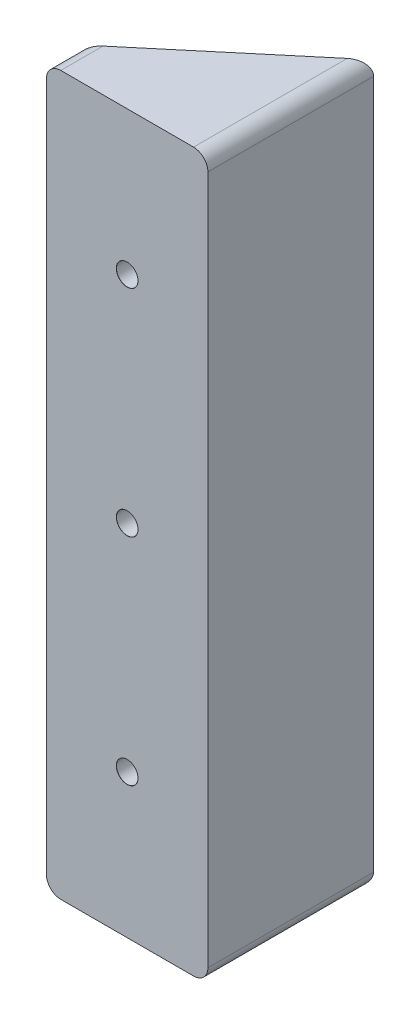
ISO-10303-21;
HEADER;
FILE_DESCRIPTION(('STEP AP214'),'2;1');
FILE_NAME('part.step','',(''),(''),'','','');
FILE_SCHEMA(('AUTOMOTIVE_DESIGN { 1 0 10303 214 1 1 1 1 }'));
ENDSEC;
DATA;
#1=APPLICATION_CONTEXT('core data for automotive mechanical design processes');
#2=APPLICATION_PROTOCOL_DEFINITION('international standard','automotive_design',2000,#1);
#3=PRODUCT_CONTEXT('',#1,'mechanical');
#4=PRODUCT('Part','Part','',(#3));
#5=PRODUCT_RELATED_PRODUCT_CATEGORY('part','',(#4));
#6=PRODUCT_DEFINITION_FORMATION('','',#4);
#7=PRODUCT_DEFINITION_CONTEXT('part definition',#1,'design');
#8=PRODUCT_DEFINITION('design','',#6,#7);
#9=PRODUCT_DEFINITION_SHAPE('','',#8);
#10=(LENGTH_UNIT() NAMED_UNIT(*) SI_UNIT(.MILLI.,.METRE.));
#11=(NAMED_UNIT(*) PLANE_ANGLE_UNIT() SI_UNIT($,.RADIAN.));
#12=(NAMED_UNIT(*) SI_UNIT($,.STERADIAN.) SOLID_ANGLE_UNIT());
#13=UNCERTAINTY_MEASURE_WITH_UNIT(LENGTH_MEASURE(1.E-05),#10,'distance_accuracy_value','');
#14=(GEOMETRIC_REPRESENTATION_CONTEXT(3) GLOBAL_UNCERTAINTY_ASSIGNED_CONTEXT((#13)) GLOBAL_UNIT_ASSIGNED_CONTEXT((#10,
#11,#12)) REPRESENTATION_CONTEXT('',''));
#15=CARTESIAN_POINT('',(0.,0.,0.));
#16=DIRECTION('',(0.,0.,1.));
#17=DIRECTION('',(1.,0.,0.));
#18=AXIS2_PLACEMENT_3D('',#15,#16,#17);
#19=CARTESIAN_POINT('',(13.8117445887715,134.272684877163,500.));
#20=DIRECTION('',(-1.,0.,0.));
#21=DIRECTION('',(0.,0.,1.));
#22=AXIS2_PLACEMENT_3D('',#19,#20,#21);
#23=PLANE('',#22);
#24=DIRECTION('',(0.,1.,0.));
#25=VECTOR('',#24,1.);
#26=CARTESIAN_POINT('',(13.8117445887715,-985.031144248079,47.1850959611087));
#27=LINE('',#26,#25);
#28=CARTESIAN_POINT('',(13.8117445887715,-61.7273151228369,47.1850959611087));
#29=VERTEX_POINT('',#28);
#30=CARTESIAN_POINT('',(13.8117445887715,130.272684877163,47.1850959611086));
#31=VERTEX_POINT('',#30);
#32=EDGE_CURVE('E49',#29,#31,#27,.T.);
#33=ORIENTED_EDGE('',*,*,#32,.F.);
#34=DIRECTION('',(0.,0.,-1.));
#35=VECTOR('',#34,1.);
#36=CARTESIAN_POINT('',(13.8117445887715,-61.7273151228369,500.));
#37=LINE('',#36,#35);
#38=CARTESIAN_POINT('',(13.8117445887715,-61.7273151228369,1.02723667248412));
#39=VERTEX_POINT('',#38);
#40=EDGE_CURVE('E128',#29,#39,#37,.T.);
#41=ORIENTED_EDGE('',*,*,#40,.T.);
#42=DIRECTION('',(0.,-1.,0.));
#43=VECTOR('',#42,1.);
#44=CARTESIAN_POINT('',(13.8117445887714,814.76440392337,1.02723667248411));
#45=LINE('',#44,#43);
#46=CARTESIAN_POINT('',(13.8117445887715,130.272684877163,1.02723667248412));
#47=VERTEX_POINT('',#46);
#48=EDGE_CURVE('E117',#47,#39,#45,.T.);
#49=ORIENTED_EDGE('',*,*,#48,.F.);
#50=DIRECTION('',(0.,0.,-1.));
#51=VECTOR('',#50,1.);
#52=CARTESIAN_POINT('',(13.8117445887715,130.272684877163,500.));
#53=LINE('',#52,#51);
#54=EDGE_CURVE('E124',#47,#31,#53,.F.);
#55=ORIENTED_EDGE('',*,*,#54,.T.);
#56=EDGE_LOOP('',(#33,#41,#49,#55));
#57=FACE_BOUND('',#56,.T.);
#58=ADVANCED_FACE('F32',(#57),#23,.F.);
#59=CARTESIAN_POINT('',(-31.1882554112285,134.272684877163,500.));
#60=DIRECTION('',(0.,-1.,0.));
#61=DIRECTION('',(0.,0.,-1.));
#62=AXIS2_PLACEMENT_3D('',#59,#60,#61);
#63=PLANE('',#62);
#64=DIRECTION('',(-1.,0.,0.));
#65=VECTOR('',#64,1.);
#66=CARTESIAN_POINT('',(-31.188255411228,134.272684877163,47.1850959611086));
#67=LINE('',#66,#65);
#68=CARTESIAN_POINT('',(9.81174458877147,134.272684877163,47.1850959611086));
#69=VERTEX_POINT('',#68);
#70=CARTESIAN_POINT('',(-27.1882554112285,134.272684877163,47.1850959611086));
#71=VERTEX_POINT('',#70);
#72=EDGE_CURVE('E158',#69,#71,#67,.T.);
#73=ORIENTED_EDGE('',*,*,#72,.F.);
#74=DIRECTION('',(0.,0.,-1.));
#75=VECTOR('',#74,1.);
#76=CARTESIAN_POINT('',(9.81174458877147,134.272684877163,500.));
#77=LINE('',#76,#75);
#78=CARTESIAN_POINT('',(9.81174458877147,134.272684877163,4.38338323489235));
#79=VERTEX_POINT('',#78);
#80=EDGE_CURVE('E56',#69,#79,#77,.T.);
#81=ORIENTED_EDGE('',*,*,#80,.T.);
#82=DIRECTION('',(0.766068203582476,0.,-0.642759292005894));
#83=VECTOR('',#82,1.);
#84=CARTESIAN_POINT('',(-258.289896932573,134.272684877163,229.330483876858));
#85=LINE('',#84,#83);
#86=CARTESIAN_POINT('',(-27.1882554112285,134.272684877163,35.4277389371684));
#87=VERTEX_POINT('',#86);
#88=EDGE_CURVE('E171',#87,#79,#85,.T.);
#89=ORIENTED_EDGE('',*,*,#88,.F.);
#90=DIRECTION('',(0.,0.,-1.));
#91=VECTOR('',#90,1.);
#92=CARTESIAN_POINT('',(-27.1882554112285,134.272684877163,500.));
#93=LINE('',#92,#91);
#94=EDGE_CURVE('E41',#87,#71,#93,.F.);
#95=ORIENTED_EDGE('',*,*,#94,.T.);
#96=EDGE_LOOP('',(#73,#81,#89,#95));
#97=FACE_BOUND('',#96,.T.);
#98=ADVANCED_FACE('F200',(#97),#63,.F.);
#99=CARTESIAN_POINT('',(-31.1882554112285,-65.7273151228369,500.));
#100=DIRECTION('',(0.,1.,0.));
#101=DIRECTION('',(0.,0.,1.));
#102=AXIS2_PLACEMENT_3D('',#99,#100,#101);
#103=PLANE('',#102);
#104=DIRECTION('',(1.,0.,0.));
#105=VECTOR('',#104,1.);
#106=CARTESIAN_POINT('',(-31.188255411228,-65.7273151228369,47.1850959611086));
#107=LINE('',#106,#105);
#108=CARTESIAN_POINT('',(-27.1882554112285,-65.7273151228369,47.1850959611086));
#109=VERTEX_POINT('',#108);
#110=CARTESIAN_POINT('',(9.81174458877147,-65.7273151228369,47.1850959611086));
#111=VERTEX_POINT('',#110);
#112=EDGE_CURVE('E118',#109,#111,#107,.T.);
#113=ORIENTED_EDGE('',*,*,#112,.F.);
#114=DIRECTION('',(0.,0.,-1.));
#115=VECTOR('',#114,1.);
#116=CARTESIAN_POINT('',(-27.1882554112285,-65.7273151228369,500.));
#117=LINE('',#116,#115);
#118=CARTESIAN_POINT('',(-27.1882554112285,-65.7273151228369,35.4277389371684));
#119=VERTEX_POINT('',#118);
#120=EDGE_CURVE('E116',#109,#119,#117,.T.);
#121=ORIENTED_EDGE('',*,*,#120,.T.);
#122=DIRECTION('',(-0.766068203582476,0.,0.642759292005894));
#123=VECTOR('',#122,1.);
#124=CARTESIAN_POINT('',(-258.289896932573,-65.7273151228369,229.330483876858));
#125=LINE('',#124,#123);
#126=CARTESIAN_POINT('',(9.81174458877147,-65.7273151228369,4.38338323489235));
#127=VERTEX_POINT('',#126);
#128=EDGE_CURVE('E179',#127,#119,#125,.T.);
#129=ORIENTED_EDGE('',*,*,#128,.F.);
#130=DIRECTION('',(0.,0.,-1.));
#131=VECTOR('',#130,1.);
#132=CARTESIAN_POINT('',(9.81174458877147,-65.7273151228369,500.));
#133=LINE('',#132,#131);
#134=EDGE_CURVE('E185',#127,#111,#133,.F.);
#135=ORIENTED_EDGE('',*,*,#134,.T.);
#136=EDGE_LOOP('',(#113,#121,#129,#135));
#137=FACE_BOUND('',#136,.T.);
#138=ADVANCED_FACE('F189',(#137),#103,.F.);
#139=CARTESIAN_POINT('',(-27.1882554112285,-61.7273151228369,500.));
#140=DIRECTION('',(0.,0.,-1.));
#141=DIRECTION('',(-1.,0.,0.));
#142=AXIS2_PLACEMENT_3D('',#139,#140,#141);
#143=CYLINDRICAL_SURFACE('',#142,4.);
#144=ORIENTED_EDGE('',*,*,#120,.F.);
#145=CARTESIAN_POINT('',(-27.1882554112285,-61.7273151228369,47.1850959611086));
#146=DIRECTION('',(0.,0.,1.));
#147=DIRECTION('',(1.,0.,0.));
#148=AXIS2_PLACEMENT_3D('',#145,#146,#147);
#149=CIRCLE('',#148,4.);
#150=CARTESIAN_POINT('',(-31.1882554112285,-61.7273151228369,47.1850959611086));
#151=VERTEX_POINT('',#150);
#152=EDGE_CURVE('E101',#109,#151,#149,.F.);
#153=ORIENTED_EDGE('',*,*,#152,.T.);
#154=DIRECTION('',(0.,0.,-1.));
#155=VECTOR('',#154,1.);
#156=CARTESIAN_POINT('',(-31.1882554112285,-61.7273151228369,500.));
#157=LINE('',#156,#155);
#158=CARTESIAN_POINT('',(-31.1882554112285,-61.7273151228367,38.7838854995766));
#159=VERTEX_POINT('',#158);
#160=EDGE_CURVE('E115',#159,#151,#157,.F.);
#161=ORIENTED_EDGE('',*,*,#160,.F.);
#162=CARTESIAN_POINT('',(-27.1882554112285,-61.7273151228369,35.4277389371684));
#163=DIRECTION('',(-0.642759292005894,0.,-0.766068203582476));
#164=DIRECTION('',(0.766068203582476,0.,-0.642759292005894));
#165=AXIS2_PLACEMENT_3D('',#162,#163,#164);
#166=ELLIPSE('',#165,5.22146720265143,4.);
#167=EDGE_CURVE('E182',#159,#119,#166,.F.);
#168=ORIENTED_EDGE('',*,*,#167,.T.);
#169=EDGE_LOOP('',(#144,#153,#161,#168));
#170=FACE_BOUND('',#169,.T.);
#171=ADVANCED_FACE('F113',(#170),#143,.T.);
#172=CARTESIAN_POINT('',(9.81174458877148,-61.7273151228369,500.));
#173=DIRECTION('',(0.,0.,-1.));
#174=DIRECTION('',(-1.,0.,0.));
#175=AXIS2_PLACEMENT_3D('',#172,#173,#174);
#176=CYLINDRICAL_SURFACE('',#175,4.);
#177=ORIENTED_EDGE('',*,*,#40,.F.);
#178=CARTESIAN_POINT('',(9.81174458877148,-61.7273151228369,47.1850959611086));
#179=DIRECTION('',(0.,0.,1.));
#180=DIRECTION('',(1.,0.,0.));
#181=AXIS2_PLACEMENT_3D('',#178,#179,#180);
#182=CIRCLE('',#181,4.);
#183=EDGE_CURVE('E162',#29,#111,#182,.F.);
#184=ORIENTED_EDGE('',*,*,#183,.T.);
#185=ORIENTED_EDGE('',*,*,#134,.F.);
#186=CARTESIAN_POINT('',(9.81174458877148,-61.7273151228369,4.38338323489235));
#187=DIRECTION('',(-0.642759292005894,0.,-0.766068203582476));
#188=DIRECTION('',(0.766068203582476,0.,-0.642759292005894));
#189=AXIS2_PLACEMENT_3D('',#186,#187,#188);
#190=ELLIPSE('',#189,5.22146720265143,4.);
#191=EDGE_CURVE('E176',#127,#39,#190,.F.);
#192=ORIENTED_EDGE('',*,*,#191,.T.);
#193=EDGE_LOOP('',(#177,#184,#185,#192));
#194=FACE_BOUND('',#193,.T.);
#195=ADVANCED_FACE('F196',(#194),#176,.T.);
#196=CARTESIAN_POINT('',(-27.1882554112285,130.272684877163,500.));
#197=DIRECTION('',(0.,0.,-1.));
#198=DIRECTION('',(-1.,0.,0.));
#199=AXIS2_PLACEMENT_3D('',#196,#197,#198);
#200=CYLINDRICAL_SURFACE('',#199,4.);
#201=DIRECTION('',(0.,0.,-1.));
#202=VECTOR('',#201,1.);
#203=CARTESIAN_POINT('',(-31.1882554112285,130.272684877163,500.));
#204=LINE('',#203,#202);
#205=CARTESIAN_POINT('',(-31.1882554112285,130.272684877163,47.1850959611086));
#206=VERTEX_POINT('',#205);
#207=CARTESIAN_POINT('',(-31.1882554112285,130.272684877163,38.7838854995766));
#208=VERTEX_POINT('',#207);
#209=EDGE_CURVE('E125',#206,#208,#204,.T.);
#210=ORIENTED_EDGE('',*,*,#209,.F.);
#211=CARTESIAN_POINT('',(-27.1882554112285,130.272684877163,47.1850959611086));
#212=DIRECTION('',(0.,0.,1.));
#213=DIRECTION('',(1.,0.,0.));
#214=AXIS2_PLACEMENT_3D('',#211,#212,#213);
#215=CIRCLE('',#214,4.);
#216=EDGE_CURVE('E104',#206,#71,#215,.F.);
#217=ORIENTED_EDGE('',*,*,#216,.T.);
#218=ORIENTED_EDGE('',*,*,#94,.F.);
#219=CARTESIAN_POINT('',(-27.1882554112285,130.272684877163,35.4277389371684));
#220=DIRECTION('',(-0.642759292005894,0.,-0.766068203582476));
#221=DIRECTION('',(0.766068203582476,0.,-0.642759292005894));
#222=AXIS2_PLACEMENT_3D('',#219,#220,#221);
#223=ELLIPSE('',#222,5.22146720265143,4.);
#224=EDGE_CURVE('E173',#87,#208,#223,.F.);
#225=ORIENTED_EDGE('',*,*,#224,.T.);
#226=EDGE_LOOP('',(#210,#217,#218,#225));
#227=FACE_BOUND('',#226,.T.);
#228=ADVANCED_FACE('F203',(#227),#200,.T.);
#229=CARTESIAN_POINT('',(9.81174458877147,130.272684877163,500.));
#230=DIRECTION('',(0.,0.,-1.));
#231=DIRECTION('',(-1.,0.,0.));
#232=AXIS2_PLACEMENT_3D('',#229,#230,#231);
#233=CYLINDRICAL_SURFACE('',#232,4.);
#234=ORIENTED_EDGE('',*,*,#80,.F.);
#235=CARTESIAN_POINT('',(9.81174458877147,130.272684877163,47.1850959611086));
#236=DIRECTION('',(0.,0.,1.));
#237=DIRECTION('',(1.,0.,0.));
#238=AXIS2_PLACEMENT_3D('',#235,#236,#237);
#239=CIRCLE('',#238,4.);
#240=EDGE_CURVE('E11',#69,#31,#239,.F.);
#241=ORIENTED_EDGE('',*,*,#240,.T.);
#242=ORIENTED_EDGE('',*,*,#54,.F.);
#243=CARTESIAN_POINT('',(9.81174458877147,130.272684877163,4.38338323489235));
#244=DIRECTION('',(-0.642759292005894,0.,-0.766068203582476));
#245=DIRECTION('',(0.766068203582476,0.,-0.642759292005894));
#246=AXIS2_PLACEMENT_3D('',#243,#244,#245);
#247=ELLIPSE('',#246,5.22146720265143,4.);
#248=EDGE_CURVE('E168',#47,#79,#247,.F.);
#249=ORIENTED_EDGE('',*,*,#248,.T.);
#250=EDGE_LOOP('',(#234,#241,#242,#249));
#251=FACE_BOUND('',#250,.T.);
#252=ADVANCED_FACE('F34',(#251),#233,.T.);
#253=CARTESIAN_POINT('',(-31.1882554112285,134.272684877163,500.));
#254=DIRECTION('',(1.,0.,0.));
#255=DIRECTION('',(0.,1.,0.));
#256=AXIS2_PLACEMENT_3D('',#253,#254,#255);
#257=PLANE('',#256);
#258=ORIENTED_EDGE('',*,*,#160,.T.);
#259=DIRECTION('',(0.,1.,0.));
#260=VECTOR('',#259,1.);
#261=CARTESIAN_POINT('',(-31.1882554112285,-985.031144248079,47.1850959611086));
#262=LINE('',#261,#260);
#263=EDGE_CURVE('E98',#151,#206,#262,.T.);
#264=ORIENTED_EDGE('',*,*,#263,.T.);
#265=ORIENTED_EDGE('',*,*,#209,.T.);
#266=DIRECTION('',(0.,-1.,0.));
#267=VECTOR('',#266,1.);
#268=CARTESIAN_POINT('',(-31.1882554112285,814.76440392337,38.7838854995766));
#269=LINE('',#268,#267);
#270=EDGE_CURVE('E123',#208,#159,#269,.T.);
#271=ORIENTED_EDGE('',*,*,#270,.T.);
#272=EDGE_LOOP('',(#258,#264,#265,#271));
#273=FACE_BOUND('',#272,.T.);
#274=ADVANCED_FACE('F121',(#273),#257,.F.);
#275=CARTESIAN_POINT('',(-31.1882554112285,814.76440392337,38.7838854995766));
#276=DIRECTION('',(-0.642759292005894,0.,-0.766068203582476));
#277=DIRECTION('',(-0.766068203582476,0.,0.642759292005894));
#278=AXIS2_PLACEMENT_3D('',#275,#276,#277);
#279=PLANE('',#278);
#280=CARTESIAN_POINT('',(-8.68825541122953,-25.7273151228364,19.9055610860312));
#281=DIRECTION('',(-0.642759292005894,0.,-0.766068203582476));
#282=DIRECTION('',(-0.766068203582476,0.,0.642759292005894));
#283=AXIS2_PLACEMENT_3D('',#280,#281,#282);
#284=ELLIPSE('',#283,3.91610040198854,2.99999999999998);
#285=CARTESIAN_POINT('',(-11.6882554112295,-25.7273151228364,22.4226710078373));
#286=VERTEX_POINT('',#285);
#287=EDGE_CURVE('E36',#286,#286,#284,.T.);
#288=ORIENTED_EDGE('',*,*,#287,.F.);
#289=EDGE_LOOP('',(#288));
#290=FACE_BOUND('',#289,.T.);
#291=CARTESIAN_POINT('',(-8.68825541122953,34.2726848771629,19.9055610860312));
#292=DIRECTION('',(-0.642759292005894,0.,-0.766068203582476));
#293=DIRECTION('',(-0.766068203582476,0.,0.642759292005894));
#294=AXIS2_PLACEMENT_3D('',#291,#292,#293);
#295=ELLIPSE('',#294,3.91610040198854,2.99999999999998);
#296=CARTESIAN_POINT('',(-11.6882554112295,34.2726848771629,22.4226710078373));
#297=VERTEX_POINT('',#296);
#298=EDGE_CURVE('E139',#297,#297,#295,.T.);
#299=ORIENTED_EDGE('',*,*,#298,.F.);
#300=EDGE_LOOP('',(#299));
#301=FACE_BOUND('',#300,.T.);
#302=CARTESIAN_POINT('',(-8.68825541122953,94.2726848771629,19.9055610860312));
#303=DIRECTION('',(-0.642759292005894,0.,-0.766068203582476));
#304=DIRECTION('',(-0.766068203582476,0.,0.642759292005894));
#305=AXIS2_PLACEMENT_3D('',#302,#303,#304);
#306=ELLIPSE('',#305,3.91610040198854,2.99999999999998);
#307=CARTESIAN_POINT('',(-11.6882554112295,94.2726848771629,22.4226710078373));
#308=VERTEX_POINT('',#307);
#309=EDGE_CURVE('E108',#308,#308,#306,.T.);
#310=ORIENTED_EDGE('',*,*,#309,.F.);
#311=EDGE_LOOP('',(#310));
#312=FACE_BOUND('',#311,.T.);
#313=ORIENTED_EDGE('',*,*,#167,.F.);
#314=ORIENTED_EDGE('',*,*,#270,.F.);
#315=ORIENTED_EDGE('',*,*,#224,.F.);
#316=ORIENTED_EDGE('',*,*,#88,.T.);
#317=ORIENTED_EDGE('',*,*,#248,.F.);
#318=ORIENTED_EDGE('',*,*,#48,.T.);
#319=ORIENTED_EDGE('',*,*,#191,.F.);
#320=ORIENTED_EDGE('',*,*,#128,.T.);
#321=EDGE_LOOP('',(#313,#314,#315,#316,#317,#318,#319,#320));
#322=FACE_BOUND('',#321,.T.);
#323=ADVANCED_FACE('F192',(#290,#301,#312,#322),#279,.T.);
#324=CARTESIAN_POINT('',(-31.1882554112285,-985.031144248079,47.1850959611086));
#325=DIRECTION('',(0.,0.,1.));
#326=DIRECTION('',(1.,0.,0.));
#327=AXIS2_PLACEMENT_3D('',#324,#325,#326);
#328=PLANE('',#327);
#329=CARTESIAN_POINT('',(-8.68825541122953,-25.7273151228364,47.1850959611085));
#330=DIRECTION('',(0.,0.,1.));
#331=DIRECTION('',(1.,0.,0.));
#332=AXIS2_PLACEMENT_3D('',#329,#330,#331);
#333=CIRCLE('',#332,3.025);
#334=CARTESIAN_POINT('',(-5.66325541122953,-25.7273151228364,47.1850959611085));
#335=VERTEX_POINT('',#334);
#336=EDGE_CURVE('E335',#335,#335,#333,.T.);
#337=ORIENTED_EDGE('',*,*,#336,.F.);
#338=EDGE_LOOP('',(#337));
#339=FACE_BOUND('',#338,.T.);
#340=CARTESIAN_POINT('',(-8.68825541122953,34.2726848771629,47.1850959611085));
#341=DIRECTION('',(0.,0.,1.));
#342=DIRECTION('',(1.,0.,0.));
#343=AXIS2_PLACEMENT_3D('',#340,#341,#342);
#344=CIRCLE('',#343,3.025);
#345=CARTESIAN_POINT('',(-5.66325541122953,34.2726848771629,47.1850959611085));
#346=VERTEX_POINT('',#345);
#347=EDGE_CURVE('E148',#346,#346,#344,.T.);
#348=ORIENTED_EDGE('',*,*,#347,.F.);
#349=EDGE_LOOP('',(#348));
#350=FACE_BOUND('',#349,.T.);
#351=CARTESIAN_POINT('',(-8.68825541122953,94.2726848771629,47.1850959611085));
#352=DIRECTION('',(0.,0.,1.));
#353=DIRECTION('',(1.,0.,0.));
#354=AXIS2_PLACEMENT_3D('',#351,#352,#353);
#355=CIRCLE('',#354,3.025);
#356=CARTESIAN_POINT('',(-5.66325541122953,94.2726848771629,47.1850959611085));
#357=VERTEX_POINT('',#356);
#358=EDGE_CURVE('E141',#357,#357,#355,.T.);
#359=ORIENTED_EDGE('',*,*,#358,.F.);
#360=EDGE_LOOP('',(#359));
#361=FACE_BOUND('',#360,.T.);
#362=ORIENTED_EDGE('',*,*,#152,.F.);
#363=ORIENTED_EDGE('',*,*,#112,.T.);
#364=ORIENTED_EDGE('',*,*,#183,.F.);
#365=ORIENTED_EDGE('',*,*,#32,.T.);
#366=ORIENTED_EDGE('',*,*,#240,.F.);
#367=ORIENTED_EDGE('',*,*,#72,.T.);
#368=ORIENTED_EDGE('',*,*,#216,.F.);
#369=ORIENTED_EDGE('',*,*,#263,.F.);
#370=EDGE_LOOP('',(#362,#363,#364,#365,#366,#367,#368,#369));
#371=FACE_BOUND('',#370,.T.);
#372=ADVANCED_FACE('F100',(#339,#350,#361,#371),#328,.T.);
#373=CARTESIAN_POINT('',(-8.68825541122953,94.2726848771629,47.1850959611085));
#374=DIRECTION('',(0.,0.,1.));
#375=DIRECTION('',(1.,0.,0.));
#376=AXIS2_PLACEMENT_3D('',#373,#374,#375);
#377=CYLINDRICAL_SURFACE('',#376,2.99999999999998);
#378=ORIENTED_EDGE('',*,*,#309,.T.);
#379=EDGE_LOOP('',(#378));
#380=FACE_BOUND('',#379,.T.);
#381=CARTESIAN_POINT('',(-8.68825541122953,94.2726848771629,47.1600959611085));
#382=DIRECTION('',(0.,0.,1.));
#383=DIRECTION('',(1.,0.,0.));
#384=AXIS2_PLACEMENT_3D('',#381,#382,#383);
#385=CIRCLE('',#384,2.99999999999998);
#386=CARTESIAN_POINT('',(-5.68825541122954,94.2726848771629,47.1600959611085));
#387=VERTEX_POINT('',#386);
#388=EDGE_CURVE('E138',#387,#387,#385,.T.);
#389=ORIENTED_EDGE('',*,*,#388,.T.);
#390=EDGE_LOOP('',(#389));
#391=FACE_BOUND('',#390,.T.);
#392=ADVANCED_FACE('F266',(#380,#391),#377,.F.);
#393=CARTESIAN_POINT('',(-8.68825541122953,94.2726848771629,47.1850959611085));
#394=DIRECTION('',(0.,0.,1.));
#395=DIRECTION('',(1.,0.,0.));
#396=AXIS2_PLACEMENT_3D('',#393,#394,#395);
#397=CONICAL_SURFACE('',#396,3.025,0.785398163397258);
#398=ORIENTED_EDGE('',*,*,#388,.F.);
#399=EDGE_LOOP('',(#398));
#400=FACE_BOUND('',#399,.T.);
#401=ORIENTED_EDGE('',*,*,#358,.T.);
#402=EDGE_LOOP('',(#401));
#403=FACE_BOUND('',#402,.T.);
#404=ADVANCED_FACE('F276',(#400,#403),#397,.F.);
#405=CARTESIAN_POINT('',(-8.68825541122953,34.2726848771629,47.1850959611085));
#406=DIRECTION('',(0.,0.,1.));
#407=DIRECTION('',(1.,0.,0.));
#408=AXIS2_PLACEMENT_3D('',#405,#406,#407);
#409=CYLINDRICAL_SURFACE('',#408,2.99999999999998);
#410=ORIENTED_EDGE('',*,*,#298,.T.);
#411=EDGE_LOOP('',(#410));
#412=FACE_BOUND('',#411,.T.);
#413=CARTESIAN_POINT('',(-8.68825541122953,34.2726848771629,47.1600959611085));
#414=DIRECTION('',(0.,0.,1.));
#415=DIRECTION('',(1.,0.,0.));
#416=AXIS2_PLACEMENT_3D('',#413,#414,#415);
#417=CIRCLE('',#416,2.99999999999998);
#418=CARTESIAN_POINT('',(-5.68825541122954,34.2726848771629,47.1600959611085));
#419=VERTEX_POINT('',#418);
#420=EDGE_CURVE('E142',#419,#419,#417,.T.);
#421=ORIENTED_EDGE('',*,*,#420,.T.);
#422=EDGE_LOOP('',(#421));
#423=FACE_BOUND('',#422,.T.);
#424=ADVANCED_FACE('F286',(#412,#423),#409,.F.);
#425=CARTESIAN_POINT('',(-8.68825541122953,34.2726848771629,47.1850959611085));
#426=DIRECTION('',(0.,0.,1.));
#427=DIRECTION('',(1.,0.,0.));
#428=AXIS2_PLACEMENT_3D('',#425,#426,#427);
#429=CONICAL_SURFACE('',#428,3.025,0.785398163397258);
#430=ORIENTED_EDGE('',*,*,#420,.F.);
#431=EDGE_LOOP('',(#430));
#432=FACE_BOUND('',#431,.T.);
#433=ORIENTED_EDGE('',*,*,#347,.T.);
#434=EDGE_LOOP('',(#433));
#435=FACE_BOUND('',#434,.T.);
#436=ADVANCED_FACE('F296',(#432,#435),#429,.F.);
#437=CARTESIAN_POINT('',(-8.68825541122953,-25.7273151228364,47.1850959611085));
#438=DIRECTION('',(0.,0.,1.));
#439=DIRECTION('',(1.,0.,0.));
#440=AXIS2_PLACEMENT_3D('',#437,#438,#439);
#441=CYLINDRICAL_SURFACE('',#440,2.99999999999998);
#442=ORIENTED_EDGE('',*,*,#287,.T.);
#443=EDGE_LOOP('',(#442));
#444=FACE_BOUND('',#443,.T.);
#445=CARTESIAN_POINT('',(-8.68825541122953,-25.7273151228364,47.1600959611085));
#446=DIRECTION('',(0.,0.,1.));
#447=DIRECTION('',(1.,0.,0.));
#448=AXIS2_PLACEMENT_3D('',#445,#446,#447);
#449=CIRCLE('',#448,2.99999999999998);
#450=CARTESIAN_POINT('',(-5.68825541122954,-25.7273151228364,47.1600959611085));
#451=VERTEX_POINT('',#450);
#452=EDGE_CURVE('E332',#451,#451,#449,.T.);
#453=ORIENTED_EDGE('',*,*,#452,.T.);
#454=EDGE_LOOP('',(#453));
#455=FACE_BOUND('',#454,.T.);
#456=ADVANCED_FACE('F305',(#444,#455),#441,.F.);
#457=CARTESIAN_POINT('',(-8.68825541122953,-25.7273151228364,47.1850959611085));
#458=DIRECTION('',(0.,0.,1.));
#459=DIRECTION('',(1.,0.,0.));
#460=AXIS2_PLACEMENT_3D('',#457,#458,#459);
#461=CONICAL_SURFACE('',#460,3.025,0.785398163397258);
#462=ORIENTED_EDGE('',*,*,#452,.F.);
#463=EDGE_LOOP('',(#462));
#464=FACE_BOUND('',#463,.T.);
#465=ORIENTED_EDGE('',*,*,#336,.T.);
#466=EDGE_LOOP('',(#465));
#467=FACE_BOUND('',#466,.T.);
#468=ADVANCED_FACE('F315',(#464,#467),#461,.F.);
#469=CLOSED_SHELL('',(#58,#98,#138,#171,#195,#228,#252,#274,#323,#372,#392,#404,#424,#436,#456,#468));
#470=MANIFOLD_SOLID_BREP('B2',#469);
#471=ADVANCED_BREP_SHAPE_REPRESENTATION('',(#18,#470),#14);
#472=SHAPE_DEFINITION_REPRESENTATION(#9,#471);
ENDSEC;
END-ISO-10303-21;
